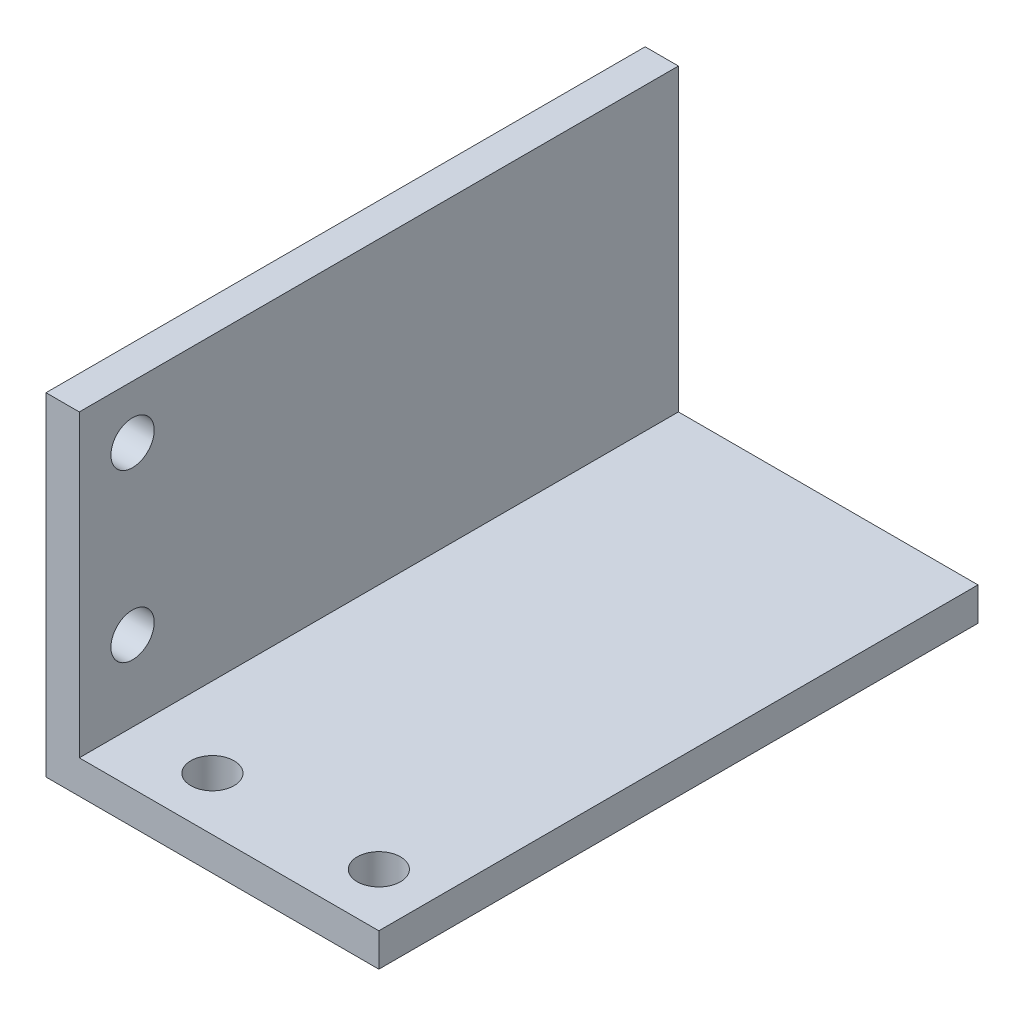
ISO-10303-21;
HEADER;
FILE_DESCRIPTION(('STEP AP214'),'2;1');
FILE_NAME('part.step','',(''),(''),'','','');
FILE_SCHEMA(('AUTOMOTIVE_DESIGN { 1 0 10303 214 1 1 1 1 }'));
ENDSEC;
DATA;
#1=APPLICATION_CONTEXT('core data for automotive mechanical design processes');
#2=APPLICATION_PROTOCOL_DEFINITION('international standard','automotive_design',2000,#1);
#3=PRODUCT_CONTEXT('',#1,'mechanical');
#4=PRODUCT('Part','Part','',(#3));
#5=PRODUCT_RELATED_PRODUCT_CATEGORY('part','',(#4));
#6=PRODUCT_DEFINITION_FORMATION('','',#4);
#7=PRODUCT_DEFINITION_CONTEXT('part definition',#1,'design');
#8=PRODUCT_DEFINITION('design','',#6,#7);
#9=PRODUCT_DEFINITION_SHAPE('','',#8);
#10=(LENGTH_UNIT() NAMED_UNIT(*) SI_UNIT(.MILLI.,.METRE.));
#11=(NAMED_UNIT(*) PLANE_ANGLE_UNIT() SI_UNIT($,.RADIAN.));
#12=(NAMED_UNIT(*) SI_UNIT($,.STERADIAN.) SOLID_ANGLE_UNIT());
#13=UNCERTAINTY_MEASURE_WITH_UNIT(LENGTH_MEASURE(1.E-05),#10,'distance_accuracy_value','');
#14=(GEOMETRIC_REPRESENTATION_CONTEXT(3) GLOBAL_UNCERTAINTY_ASSIGNED_CONTEXT((#13)) GLOBAL_UNIT_ASSIGNED_CONTEXT((#10,
#11,#12)) REPRESENTATION_CONTEXT('',''));
#15=CARTESIAN_POINT('',(0.,0.,0.));
#16=DIRECTION('',(0.,0.,1.));
#17=DIRECTION('',(1.,0.,0.));
#18=AXIS2_PLACEMENT_3D('',#15,#16,#17);
#19=CARTESIAN_POINT('',(50.,0.,90.));
#20=DIRECTION('',(0.,1.,0.));
#21=DIRECTION('',(-1.,0.,0.));
#22=AXIS2_PLACEMENT_3D('',#19,#20,#21);
#23=PLANE('',#22);
#24=CARTESIAN_POINT('',(17.,0.,82.));
#25=DIRECTION('',(0.,-1.,0.));
#26=DIRECTION('',(0.,0.,-1.));
#27=AXIS2_PLACEMENT_3D('',#24,#25,#26);
#28=CIRCLE('',#27,3.24999999999999);
#29=CARTESIAN_POINT('',(17.,0.,78.75));
#30=VERTEX_POINT('',#29);
#31=EDGE_CURVE('E163',#30,#30,#28,.T.);
#32=ORIENTED_EDGE('',*,*,#31,.F.);
#33=EDGE_LOOP('',(#32));
#34=FACE_BOUND('',#33,.T.);
#35=CARTESIAN_POINT('',(42.,0.,82.));
#36=DIRECTION('',(0.,-1.,0.));
#37=DIRECTION('',(0.,0.,-1.));
#38=AXIS2_PLACEMENT_3D('',#35,#36,#37);
#39=CIRCLE('',#38,3.24999999999999);
#40=CARTESIAN_POINT('',(42.,0.,78.75));
#41=VERTEX_POINT('',#40);
#42=EDGE_CURVE('E166',#41,#41,#39,.T.);
#43=ORIENTED_EDGE('',*,*,#42,.F.);
#44=EDGE_LOOP('',(#43));
#45=FACE_BOUND('',#44,.T.);
#46=DIRECTION('',(1.,0.,0.));
#47=VECTOR('',#46,1.);
#48=CARTESIAN_POINT('',(50.,0.,0.));
#49=LINE('',#48,#47);
#50=CARTESIAN_POINT('',(0.,0.,0.));
#51=VERTEX_POINT('',#50);
#52=CARTESIAN_POINT('',(50.,0.,0.));
#53=VERTEX_POINT('',#52);
#54=EDGE_CURVE('E117',#51,#53,#49,.T.);
#55=ORIENTED_EDGE('',*,*,#54,.T.);
#56=DIRECTION('',(0.,0.,-1.));
#57=VECTOR('',#56,1.);
#58=CARTESIAN_POINT('',(50.,0.,90.));
#59=LINE('',#58,#57);
#60=CARTESIAN_POINT('',(50.,0.,90.));
#61=VERTEX_POINT('',#60);
#62=EDGE_CURVE('E11',#61,#53,#59,.T.);
#63=ORIENTED_EDGE('',*,*,#62,.F.);
#64=DIRECTION('',(1.,0.,0.));
#65=VECTOR('',#64,1.);
#66=CARTESIAN_POINT('',(50.,0.,90.));
#67=LINE('',#66,#65);
#68=CARTESIAN_POINT('',(0.,0.,90.));
#69=VERTEX_POINT('',#68);
#70=EDGE_CURVE('E128',#69,#61,#67,.T.);
#71=ORIENTED_EDGE('',*,*,#70,.F.);
#72=DIRECTION('',(0.,0.,-1.));
#73=VECTOR('',#72,1.);
#74=CARTESIAN_POINT('',(0.,0.,90.));
#75=LINE('',#74,#73);
#76=EDGE_CURVE('E113',#69,#51,#75,.T.);
#77=ORIENTED_EDGE('',*,*,#76,.T.);
#78=EDGE_LOOP('',(#55,#63,#71,#77));
#79=FACE_BOUND('',#78,.T.);
#80=ADVANCED_FACE('F33',(#34,#45,#79),#23,.F.);
#81=CARTESIAN_POINT('',(50.,5.,90.));
#82=DIRECTION('',(-1.,0.,0.));
#83=DIRECTION('',(0.,0.,1.));
#84=AXIS2_PLACEMENT_3D('',#81,#82,#83);
#85=PLANE('',#84);
#86=DIRECTION('',(0.,1.,0.));
#87=VECTOR('',#86,1.);
#88=CARTESIAN_POINT('',(50.,5.,0.));
#89=LINE('',#88,#87);
#90=CARTESIAN_POINT('',(50.,5.,0.));
#91=VERTEX_POINT('',#90);
#92=EDGE_CURVE('E120',#53,#91,#89,.T.);
#93=ORIENTED_EDGE('',*,*,#92,.T.);
#94=DIRECTION('',(0.,0.,-1.));
#95=VECTOR('',#94,1.);
#96=CARTESIAN_POINT('',(50.,5.,90.));
#97=LINE('',#96,#95);
#98=CARTESIAN_POINT('',(50.,5.,90.));
#99=VERTEX_POINT('',#98);
#100=EDGE_CURVE('E41',#99,#91,#97,.T.);
#101=ORIENTED_EDGE('',*,*,#100,.F.);
#102=DIRECTION('',(0.,1.,0.));
#103=VECTOR('',#102,1.);
#104=CARTESIAN_POINT('',(50.,5.,90.));
#105=LINE('',#104,#103);
#106=EDGE_CURVE('E86',#61,#99,#105,.T.);
#107=ORIENTED_EDGE('',*,*,#106,.F.);
#108=ORIENTED_EDGE('',*,*,#62,.T.);
#109=EDGE_LOOP('',(#93,#101,#107,#108));
#110=FACE_BOUND('',#109,.T.);
#111=ADVANCED_FACE('F155',(#110),#85,.F.);
#112=CARTESIAN_POINT('',(5.00000000000001,5.,90.));
#113=DIRECTION('',(0.,-1.,0.));
#114=DIRECTION('',(1.,0.,0.));
#115=AXIS2_PLACEMENT_3D('',#112,#113,#114);
#116=PLANE('',#115);
#117=CARTESIAN_POINT('',(17.,5.,82.));
#118=DIRECTION('',(0.,-1.,0.));
#119=DIRECTION('',(1.,0.,0.));
#120=AXIS2_PLACEMENT_3D('',#117,#118,#119);
#121=CIRCLE('',#120,3.24999999999999);
#122=CARTESIAN_POINT('',(20.25,5.,82.));
#123=VERTEX_POINT('',#122);
#124=EDGE_CURVE('E168',#123,#123,#121,.T.);
#125=ORIENTED_EDGE('',*,*,#124,.T.);
#126=EDGE_LOOP('',(#125));
#127=FACE_BOUND('',#126,.T.);
#128=CARTESIAN_POINT('',(42.,5.,82.));
#129=DIRECTION('',(0.,-1.,0.));
#130=DIRECTION('',(1.,0.,0.));
#131=AXIS2_PLACEMENT_3D('',#128,#129,#130);
#132=CIRCLE('',#131,3.24999999999999);
#133=CARTESIAN_POINT('',(45.25,5.,82.));
#134=VERTEX_POINT('',#133);
#135=EDGE_CURVE('E121',#134,#134,#132,.T.);
#136=ORIENTED_EDGE('',*,*,#135,.T.);
#137=EDGE_LOOP('',(#136));
#138=FACE_BOUND('',#137,.T.);
#139=DIRECTION('',(-1.,0.,0.));
#140=VECTOR('',#139,1.);
#141=CARTESIAN_POINT('',(5.00000000000001,5.,0.));
#142=LINE('',#141,#140);
#143=CARTESIAN_POINT('',(5.00000000000001,5.,0.));
#144=VERTEX_POINT('',#143);
#145=EDGE_CURVE('E123',#91,#144,#142,.T.);
#146=ORIENTED_EDGE('',*,*,#145,.T.);
#147=DIRECTION('',(0.,0.,-1.));
#148=VECTOR('',#147,1.);
#149=CARTESIAN_POINT('',(5.00000000000001,5.,90.));
#150=LINE('',#149,#148);
#151=CARTESIAN_POINT('',(5.00000000000001,5.,90.));
#152=VERTEX_POINT('',#151);
#153=EDGE_CURVE('E108',#152,#144,#150,.T.);
#154=ORIENTED_EDGE('',*,*,#153,.F.);
#155=DIRECTION('',(-1.,0.,0.));
#156=VECTOR('',#155,1.);
#157=CARTESIAN_POINT('',(5.00000000000001,5.,90.));
#158=LINE('',#157,#156);
#159=EDGE_CURVE('E99',#99,#152,#158,.T.);
#160=ORIENTED_EDGE('',*,*,#159,.F.);
#161=ORIENTED_EDGE('',*,*,#100,.T.);
#162=EDGE_LOOP('',(#146,#154,#160,#161));
#163=FACE_BOUND('',#162,.T.);
#164=ADVANCED_FACE('F134',(#127,#138,#163),#116,.F.);
#165=CARTESIAN_POINT('',(5.,50.,90.));
#166=DIRECTION('',(-1.,0.,0.));
#167=DIRECTION('',(0.,-1.,0.));
#168=AXIS2_PLACEMENT_3D('',#165,#166,#167);
#169=PLANE('',#168);
#170=CARTESIAN_POINT('',(5.,42.,82.));
#171=DIRECTION('',(-1.,0.,0.));
#172=DIRECTION('',(0.,0.,1.));
#173=AXIS2_PLACEMENT_3D('',#170,#171,#172);
#174=CIRCLE('',#173,3.25);
#175=CARTESIAN_POINT('',(5.,42.,85.25));
#176=VERTEX_POINT('',#175);
#177=EDGE_CURVE('E184',#176,#176,#174,.T.);
#178=ORIENTED_EDGE('',*,*,#177,.T.);
#179=EDGE_LOOP('',(#178));
#180=FACE_BOUND('',#179,.T.);
#181=CARTESIAN_POINT('',(5.,17.,82.));
#182=DIRECTION('',(-1.,0.,0.));
#183=DIRECTION('',(0.,0.,1.));
#184=AXIS2_PLACEMENT_3D('',#181,#182,#183);
#185=CIRCLE('',#184,3.25);
#186=CARTESIAN_POINT('',(5.,17.,85.25));
#187=VERTEX_POINT('',#186);
#188=EDGE_CURVE('E178',#187,#187,#185,.T.);
#189=ORIENTED_EDGE('',*,*,#188,.T.);
#190=EDGE_LOOP('',(#189));
#191=FACE_BOUND('',#190,.T.);
#192=DIRECTION('',(0.,1.,0.));
#193=VECTOR('',#192,1.);
#194=CARTESIAN_POINT('',(5.,50.,0.));
#195=LINE('',#194,#193);
#196=CARTESIAN_POINT('',(5.,50.,0.));
#197=VERTEX_POINT('',#196);
#198=EDGE_CURVE('E107',#144,#197,#195,.T.);
#199=ORIENTED_EDGE('',*,*,#198,.T.);
#200=DIRECTION('',(0.,0.,-1.));
#201=VECTOR('',#200,1.);
#202=CARTESIAN_POINT('',(5.,50.,90.));
#203=LINE('',#202,#201);
#204=CARTESIAN_POINT('',(5.,50.,90.));
#205=VERTEX_POINT('',#204);
#206=EDGE_CURVE('E104',#205,#197,#203,.T.);
#207=ORIENTED_EDGE('',*,*,#206,.F.);
#208=DIRECTION('',(0.,1.,0.));
#209=VECTOR('',#208,1.);
#210=CARTESIAN_POINT('',(5.,50.,90.));
#211=LINE('',#210,#209);
#212=EDGE_CURVE('E93',#152,#205,#211,.T.);
#213=ORIENTED_EDGE('',*,*,#212,.F.);
#214=ORIENTED_EDGE('',*,*,#153,.T.);
#215=EDGE_LOOP('',(#199,#207,#213,#214));
#216=FACE_BOUND('',#215,.T.);
#217=ADVANCED_FACE('F105',(#180,#191,#216),#169,.F.);
#218=CARTESIAN_POINT('',(0.,50.,90.));
#219=DIRECTION('',(0.,-1.,0.));
#220=DIRECTION('',(0.,0.,-1.));
#221=AXIS2_PLACEMENT_3D('',#218,#219,#220);
#222=PLANE('',#221);
#223=DIRECTION('',(-1.,0.,0.));
#224=VECTOR('',#223,1.);
#225=CARTESIAN_POINT('',(0.,50.,0.));
#226=LINE('',#225,#224);
#227=CARTESIAN_POINT('',(0.,50.,0.));
#228=VERTEX_POINT('',#227);
#229=EDGE_CURVE('E72',#197,#228,#226,.T.);
#230=ORIENTED_EDGE('',*,*,#229,.T.);
#231=DIRECTION('',(0.,0.,-1.));
#232=VECTOR('',#231,1.);
#233=CARTESIAN_POINT('',(0.,50.,90.));
#234=LINE('',#233,#232);
#235=CARTESIAN_POINT('',(0.,50.,90.));
#236=VERTEX_POINT('',#235);
#237=EDGE_CURVE('E109',#236,#228,#234,.T.);
#238=ORIENTED_EDGE('',*,*,#237,.F.);
#239=DIRECTION('',(-1.,0.,0.));
#240=VECTOR('',#239,1.);
#241=CARTESIAN_POINT('',(0.,50.,90.));
#242=LINE('',#241,#240);
#243=EDGE_CURVE('E97',#205,#236,#242,.T.);
#244=ORIENTED_EDGE('',*,*,#243,.F.);
#245=ORIENTED_EDGE('',*,*,#206,.T.);
#246=EDGE_LOOP('',(#230,#238,#244,#245));
#247=FACE_BOUND('',#246,.T.);
#248=ADVANCED_FACE('F111',(#247),#222,.F.);
#249=CARTESIAN_POINT('',(0.,0.,90.));
#250=DIRECTION('',(1.,0.,0.));
#251=DIRECTION('',(0.,0.,-1.));
#252=AXIS2_PLACEMENT_3D('',#249,#250,#251);
#253=PLANE('',#252);
#254=CARTESIAN_POINT('',(0.,42.,82.));
#255=DIRECTION('',(-1.,0.,0.));
#256=DIRECTION('',(0.,0.,1.));
#257=AXIS2_PLACEMENT_3D('',#254,#255,#256);
#258=CIRCLE('',#257,3.24999999999999);
#259=CARTESIAN_POINT('',(0.,42.,85.25));
#260=VERTEX_POINT('',#259);
#261=EDGE_CURVE('E187',#260,#260,#258,.T.);
#262=ORIENTED_EDGE('',*,*,#261,.F.);
#263=EDGE_LOOP('',(#262));
#264=FACE_BOUND('',#263,.T.);
#265=CARTESIAN_POINT('',(0.,17.,82.));
#266=DIRECTION('',(-1.,0.,0.));
#267=DIRECTION('',(0.,0.,1.));
#268=AXIS2_PLACEMENT_3D('',#265,#266,#267);
#269=CIRCLE('',#268,3.24999999999999);
#270=CARTESIAN_POINT('',(0.,17.,85.25));
#271=VERTEX_POINT('',#270);
#272=EDGE_CURVE('E181',#271,#271,#269,.T.);
#273=ORIENTED_EDGE('',*,*,#272,.F.);
#274=EDGE_LOOP('',(#273));
#275=FACE_BOUND('',#274,.T.);
#276=DIRECTION('',(0.,-1.,0.));
#277=VECTOR('',#276,1.);
#278=CARTESIAN_POINT('',(0.,0.,0.));
#279=LINE('',#278,#277);
#280=EDGE_CURVE('E78',#228,#51,#279,.T.);
#281=ORIENTED_EDGE('',*,*,#280,.T.);
#282=ORIENTED_EDGE('',*,*,#76,.F.);
#283=DIRECTION('',(0.,-1.,0.));
#284=VECTOR('',#283,1.);
#285=CARTESIAN_POINT('',(0.,0.,90.));
#286=LINE('',#285,#284);
#287=EDGE_CURVE('E49',#236,#69,#286,.T.);
#288=ORIENTED_EDGE('',*,*,#287,.F.);
#289=ORIENTED_EDGE('',*,*,#237,.T.);
#290=EDGE_LOOP('',(#281,#282,#288,#289));
#291=FACE_BOUND('',#290,.T.);
#292=ADVANCED_FACE('F141',(#264,#275,#291),#253,.F.);
#293=CARTESIAN_POINT('',(0.,0.,90.));
#294=DIRECTION('',(0.,0.,-1.));
#295=DIRECTION('',(-1.,0.,0.));
#296=AXIS2_PLACEMENT_3D('',#293,#294,#295);
#297=PLANE('',#296);
#298=ORIENTED_EDGE('',*,*,#70,.T.);
#299=ORIENTED_EDGE('',*,*,#106,.T.);
#300=ORIENTED_EDGE('',*,*,#159,.T.);
#301=ORIENTED_EDGE('',*,*,#212,.T.);
#302=ORIENTED_EDGE('',*,*,#243,.T.);
#303=ORIENTED_EDGE('',*,*,#287,.T.);
#304=EDGE_LOOP('',(#298,#299,#300,#301,#302,#303));
#305=FACE_BOUND('',#304,.T.);
#306=ADVANCED_FACE('F95',(#305),#297,.F.);
#307=CARTESIAN_POINT('',(0.,0.,0.));
#308=DIRECTION('',(0.,0.,-1.));
#309=DIRECTION('',(-1.,0.,0.));
#310=AXIS2_PLACEMENT_3D('',#307,#308,#309);
#311=PLANE('',#310);
#312=ORIENTED_EDGE('',*,*,#54,.F.);
#313=ORIENTED_EDGE('',*,*,#280,.F.);
#314=ORIENTED_EDGE('',*,*,#229,.F.);
#315=ORIENTED_EDGE('',*,*,#198,.F.);
#316=ORIENTED_EDGE('',*,*,#145,.F.);
#317=ORIENTED_EDGE('',*,*,#92,.F.);
#318=EDGE_LOOP('',(#312,#313,#314,#315,#316,#317));
#319=FACE_BOUND('',#318,.T.);
#320=ADVANCED_FACE('F137',(#319),#311,.T.);
#321=CARTESIAN_POINT('',(42.,0.,82.));
#322=DIRECTION('',(0.,-1.,0.));
#323=DIRECTION('',(0.,0.,-1.));
#324=AXIS2_PLACEMENT_3D('',#321,#322,#323);
#325=CYLINDRICAL_SURFACE('',#324,3.24999999999999);
#326=ORIENTED_EDGE('',*,*,#42,.T.);
#327=EDGE_LOOP('',(#326));
#328=FACE_BOUND('',#327,.T.);
#329=ORIENTED_EDGE('',*,*,#135,.F.);
#330=EDGE_LOOP('',(#329));
#331=FACE_BOUND('',#330,.T.);
#332=ADVANCED_FACE('F205',(#328,#331),#325,.F.);
#333=CARTESIAN_POINT('',(17.,0.,82.));
#334=DIRECTION('',(0.,-1.,0.));
#335=DIRECTION('',(0.,0.,-1.));
#336=AXIS2_PLACEMENT_3D('',#333,#334,#335);
#337=CYLINDRICAL_SURFACE('',#336,3.24999999999999);
#338=ORIENTED_EDGE('',*,*,#31,.T.);
#339=EDGE_LOOP('',(#338));
#340=FACE_BOUND('',#339,.T.);
#341=ORIENTED_EDGE('',*,*,#124,.F.);
#342=EDGE_LOOP('',(#341));
#343=FACE_BOUND('',#342,.T.);
#344=ADVANCED_FACE('F198',(#340,#343),#337,.F.);
#345=CARTESIAN_POINT('',(0.,17.,82.));
#346=DIRECTION('',(-1.,0.,0.));
#347=DIRECTION('',(0.,0.,1.));
#348=AXIS2_PLACEMENT_3D('',#345,#346,#347);
#349=CYLINDRICAL_SURFACE('',#348,3.24999999999999);
#350=ORIENTED_EDGE('',*,*,#188,.F.);
#351=EDGE_LOOP('',(#350));
#352=FACE_BOUND('',#351,.T.);
#353=ORIENTED_EDGE('',*,*,#272,.T.);
#354=EDGE_LOOP('',(#353));
#355=FACE_BOUND('',#354,.T.);
#356=ADVANCED_FACE('F192',(#352,#355),#349,.F.);
#357=CARTESIAN_POINT('',(0.,42.,82.));
#358=DIRECTION('',(-1.,0.,0.));
#359=DIRECTION('',(0.,0.,1.));
#360=AXIS2_PLACEMENT_3D('',#357,#358,#359);
#361=CYLINDRICAL_SURFACE('',#360,3.24999999999999);
#362=ORIENTED_EDGE('',*,*,#177,.F.);
#363=EDGE_LOOP('',(#362));
#364=FACE_BOUND('',#363,.T.);
#365=ORIENTED_EDGE('',*,*,#261,.T.);
#366=EDGE_LOOP('',(#365));
#367=FACE_BOUND('',#366,.T.);
#368=ADVANCED_FACE('F190',(#364,#367),#361,.F.);
#369=CLOSED_SHELL('',(#80,#111,#164,#217,#248,#292,#306,#320,#332,#344,#356,#368));
#370=MANIFOLD_SOLID_BREP('B2',#369);
#371=ADVANCED_BREP_SHAPE_REPRESENTATION('',(#18,#370),#14);
#372=SHAPE_DEFINITION_REPRESENTATION(#9,#371);
ENDSEC;
END-ISO-10303-21;
